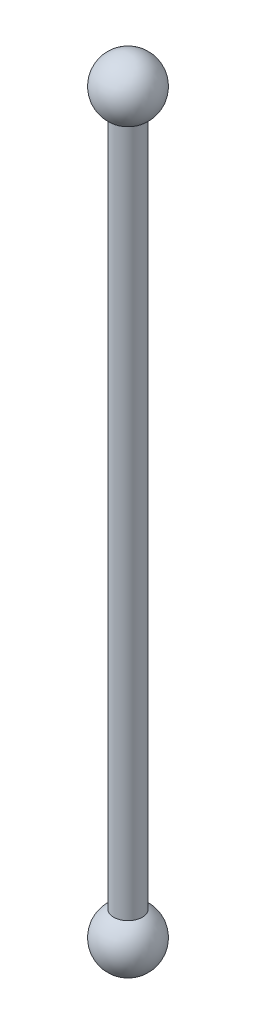
ISO-10303-21;
HEADER;
FILE_DESCRIPTION(('STEP AP214'),'2;1');
FILE_NAME('part.step','',(''),(''),'','','');
FILE_SCHEMA(('AUTOMOTIVE_DESIGN { 1 0 10303 214 1 1 1 1 }'));
ENDSEC;
DATA;
#1=APPLICATION_CONTEXT('core data for automotive mechanical design processes');
#2=APPLICATION_PROTOCOL_DEFINITION('international standard','automotive_design',2000,#1);
#3=PRODUCT_CONTEXT('',#1,'mechanical');
#4=PRODUCT('Part','Part','',(#3));
#5=PRODUCT_RELATED_PRODUCT_CATEGORY('part','',(#4));
#6=PRODUCT_DEFINITION_FORMATION('','',#4);
#7=PRODUCT_DEFINITION_CONTEXT('part definition',#1,'design');
#8=PRODUCT_DEFINITION('design','',#6,#7);
#9=PRODUCT_DEFINITION_SHAPE('','',#8);
#10=(LENGTH_UNIT() NAMED_UNIT(*) SI_UNIT(.MILLI.,.METRE.));
#11=(NAMED_UNIT(*) PLANE_ANGLE_UNIT() SI_UNIT($,.RADIAN.));
#12=(NAMED_UNIT(*) SI_UNIT($,.STERADIAN.) SOLID_ANGLE_UNIT());
#13=UNCERTAINTY_MEASURE_WITH_UNIT(LENGTH_MEASURE(1.E-05),#10,'distance_accuracy_value','');
#14=(GEOMETRIC_REPRESENTATION_CONTEXT(3) GLOBAL_UNCERTAINTY_ASSIGNED_CONTEXT((#13)) GLOBAL_UNIT_ASSIGNED_CONTEXT((#10,
#11,#12)) REPRESENTATION_CONTEXT('',''));
#15=CARTESIAN_POINT('',(0.,0.,0.));
#16=DIRECTION('',(0.,0.,1.));
#17=DIRECTION('',(1.,0.,0.));
#18=AXIS2_PLACEMENT_3D('',#15,#16,#17);
#19=CARTESIAN_POINT('',(0.,-4.33012701892219,0.));
#20=DIRECTION('',(0.,-1.,0.));
#21=DIRECTION('',(-1.,0.,0.));
#22=AXIS2_PLACEMENT_3D('',#19,#20,#21);
#23=SPHERICAL_SURFACE('',#22,5.);
#24=CARTESIAN_POINT('',(0.,0.,0.));
#25=DIRECTION('',(0.,-1.,0.));
#26=DIRECTION('',(0.,0.,-1.));
#27=AXIS2_PLACEMENT_3D('',#24,#25,#26);
#28=CIRCLE('',#27,2.5);
#29=CARTESIAN_POINT('',(0.,0.,-2.5));
#30=VERTEX_POINT('',#29);
#31=EDGE_CURVE('E10',#30,#30,#28,.T.);
#32=ORIENTED_EDGE('',*,*,#31,.T.);
#33=EDGE_LOOP('',(#32));
#34=FACE_BOUND('',#33,.T.);
#35=ADVANCED_FACE('F37',(#34),#23,.T.);
#36=CARTESIAN_POINT('',(0.,-9.33012701892219,0.));
#37=DIRECTION('',(0.,-1.,0.));
#38=DIRECTION('',(0.,0.,-1.));
#39=AXIS2_PLACEMENT_3D('',#36,#37,#38);
#40=CYLINDRICAL_SURFACE('',#39,2.5);
#41=ORIENTED_EDGE('',*,*,#31,.F.);
#42=EDGE_LOOP('',(#41));
#43=FACE_BOUND('',#42,.T.);
#44=CARTESIAN_POINT('',(0.,120.,0.));
#45=DIRECTION('',(0.,-1.,0.));
#46=DIRECTION('',(0.,0.,-1.));
#47=AXIS2_PLACEMENT_3D('',#44,#45,#46);
#48=CIRCLE('',#47,2.5);
#49=CARTESIAN_POINT('',(0.,120.,-2.5));
#50=VERTEX_POINT('',#49);
#51=EDGE_CURVE('E44',#50,#50,#48,.T.);
#52=ORIENTED_EDGE('',*,*,#51,.T.);
#53=EDGE_LOOP('',(#52));
#54=FACE_BOUND('',#53,.T.);
#55=ADVANCED_FACE('F51',(#43,#54),#40,.T.);
#56=CARTESIAN_POINT('',(0.,124.330127018922,0.));
#57=DIRECTION('',(0.,1.,0.));
#58=DIRECTION('',(-1.,0.,0.));
#59=AXIS2_PLACEMENT_3D('',#56,#57,#58);
#60=SPHERICAL_SURFACE('',#59,5.);
#61=ORIENTED_EDGE('',*,*,#51,.F.);
#62=EDGE_LOOP('',(#61));
#63=FACE_BOUND('',#62,.T.);
#64=ADVANCED_FACE('F53',(#63),#60,.T.);
#65=CLOSED_SHELL('',(#35,#55,#64));
#66=MANIFOLD_SOLID_BREP('B2',#65);
#67=ADVANCED_BREP_SHAPE_REPRESENTATION('',(#18,#66),#14);
#68=SHAPE_DEFINITION_REPRESENTATION(#9,#67);
ENDSEC;
END-ISO-10303-21;
